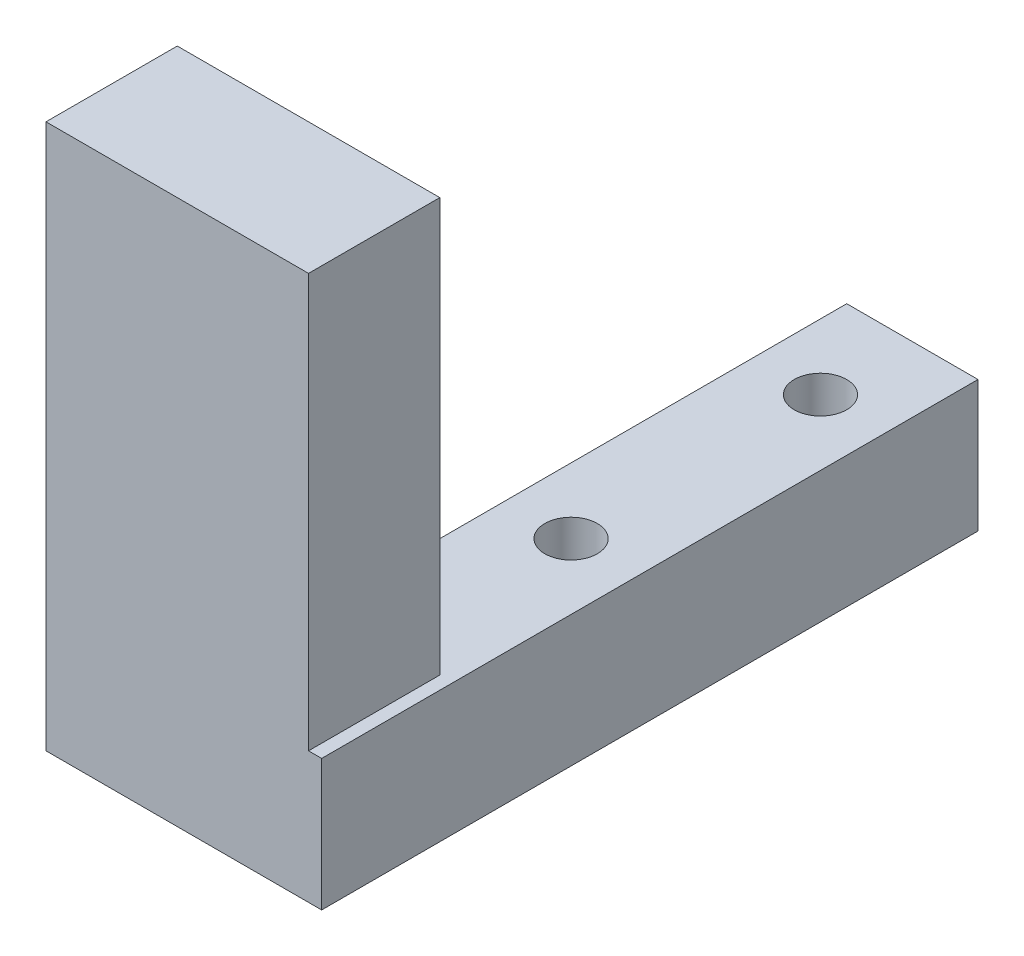
ISO-10303-21;
HEADER;
FILE_DESCRIPTION(('STEP AP214'),'2;1');
FILE_NAME('part.step','',(''),(''),'','','');
FILE_SCHEMA(('AUTOMOTIVE_DESIGN { 1 0 10303 214 1 1 1 1 }'));
ENDSEC;
DATA;
#1=APPLICATION_CONTEXT('core data for automotive mechanical design processes');
#2=APPLICATION_PROTOCOL_DEFINITION('international standard','automotive_design',2000,#1);
#3=PRODUCT_CONTEXT('',#1,'mechanical');
#4=PRODUCT('Part','Part','',(#3));
#5=PRODUCT_RELATED_PRODUCT_CATEGORY('part','',(#4));
#6=PRODUCT_DEFINITION_FORMATION('','',#4);
#7=PRODUCT_DEFINITION_CONTEXT('part definition',#1,'design');
#8=PRODUCT_DEFINITION('design','',#6,#7);
#9=PRODUCT_DEFINITION_SHAPE('','',#8);
#10=(LENGTH_UNIT() NAMED_UNIT(*) SI_UNIT(.MILLI.,.METRE.));
#11=(NAMED_UNIT(*) PLANE_ANGLE_UNIT() SI_UNIT($,.RADIAN.));
#12=(NAMED_UNIT(*) SI_UNIT($,.STERADIAN.) SOLID_ANGLE_UNIT());
#13=UNCERTAINTY_MEASURE_WITH_UNIT(LENGTH_MEASURE(1.E-05),#10,'distance_accuracy_value','');
#14=(GEOMETRIC_REPRESENTATION_CONTEXT(3) GLOBAL_UNCERTAINTY_ASSIGNED_CONTEXT((#13)) GLOBAL_UNIT_ASSIGNED_CONTEXT((#10,
#11,#12)) REPRESENTATION_CONTEXT('',''));
#15=CARTESIAN_POINT('',(0.,0.,0.));
#16=DIRECTION('',(0.,0.,1.));
#17=DIRECTION('',(1.,0.,0.));
#18=AXIS2_PLACEMENT_3D('',#15,#16,#17);
#19=CARTESIAN_POINT('',(-7.85128298838194,3.64329268292683,50.));
#20=DIRECTION('',(0.,-1.,0.));
#21=DIRECTION('',(0.,0.,-1.));
#22=AXIS2_PLACEMENT_3D('',#19,#20,#21);
#23=PLANE('',#22);
#24=CARTESIAN_POINT('',(-2.85128298838193,3.64329268292683,26.));
#25=DIRECTION('',(0.,1.,0.));
#26=DIRECTION('',(0.,0.,1.));
#27=AXIS2_PLACEMENT_3D('',#24,#25,#26);
#28=CIRCLE('',#27,2.);
#29=CARTESIAN_POINT('',(-2.85128298838193,3.64329268292683,28.));
#30=VERTEX_POINT('',#29);
#31=EDGE_CURVE('E131',#30,#30,#28,.T.);
#32=ORIENTED_EDGE('',*,*,#31,.F.);
#33=EDGE_LOOP('',(#32));
#34=FACE_BOUND('',#33,.T.);
#35=CARTESIAN_POINT('',(-2.85128298838194,3.64329268292683,7.));
#36=DIRECTION('',(0.,1.,0.));
#37=DIRECTION('',(0.,0.,1.));
#38=AXIS2_PLACEMENT_3D('',#35,#36,#37);
#39=CIRCLE('',#38,2.);
#40=CARTESIAN_POINT('',(-2.85128298838194,3.64329268292683,9.));
#41=VERTEX_POINT('',#40);
#42=EDGE_CURVE('E134',#41,#41,#39,.T.);
#43=ORIENTED_EDGE('',*,*,#42,.F.);
#44=EDGE_LOOP('',(#43));
#45=FACE_BOUND('',#44,.T.);
#46=DIRECTION('',(-1.,0.,0.));
#47=VECTOR('',#46,1.);
#48=CARTESIAN_POINT('',(-18.8512829883819,3.64329268292683,40.));
#49=LINE('',#48,#47);
#50=CARTESIAN_POINT('',(1.14871701161806,3.64329268292683,40.));
#51=VERTEX_POINT('',#50);
#52=CARTESIAN_POINT('',(-7.85128298838194,3.64329268292683,40.));
#53=VERTEX_POINT('',#52);
#54=EDGE_CURVE('E142',#51,#53,#49,.T.);
#55=ORIENTED_EDGE('',*,*,#54,.F.);
#56=DIRECTION('',(0.,0.,-1.));
#57=VECTOR('',#56,1.);
#58=CARTESIAN_POINT('',(1.14871701161806,3.64329268292683,50.));
#59=LINE('',#58,#57);
#60=CARTESIAN_POINT('',(1.14871701161806,3.64329268292683,50.));
#61=VERTEX_POINT('',#60);
#62=EDGE_CURVE('E52',#61,#51,#59,.T.);
#63=ORIENTED_EDGE('',*,*,#62,.F.);
#64=DIRECTION('',(-1.,0.,0.));
#65=VECTOR('',#64,1.);
#66=CARTESIAN_POINT('',(-7.85128298838194,3.64329268292683,50.));
#67=LINE('',#66,#65);
#68=CARTESIAN_POINT('',(2.14871701161806,3.64329268292683,50.));
#69=VERTEX_POINT('',#68);
#70=EDGE_CURVE('E162',#69,#61,#67,.T.);
#71=ORIENTED_EDGE('',*,*,#70,.F.);
#72=DIRECTION('',(0.,0.,-1.));
#73=VECTOR('',#72,1.);
#74=CARTESIAN_POINT('',(2.14871701161806,3.64329268292683,50.));
#75=LINE('',#74,#73);
#76=CARTESIAN_POINT('',(2.14871701161806,3.64329268292683,0.));
#77=VERTEX_POINT('',#76);
#78=EDGE_CURVE('E179',#69,#77,#75,.T.);
#79=ORIENTED_EDGE('',*,*,#78,.T.);
#80=DIRECTION('',(-1.,0.,0.));
#81=VECTOR('',#80,1.);
#82=CARTESIAN_POINT('',(-7.85128298838194,3.64329268292683,0.));
#83=LINE('',#82,#81);
#84=CARTESIAN_POINT('',(-7.85128298838194,3.64329268292683,0.));
#85=VERTEX_POINT('',#84);
#86=EDGE_CURVE('E175',#77,#85,#83,.T.);
#87=ORIENTED_EDGE('',*,*,#86,.T.);
#88=DIRECTION('',(0.,0.,-1.));
#89=VECTOR('',#88,1.);
#90=CARTESIAN_POINT('',(-7.85128298838194,3.64329268292683,50.));
#91=LINE('',#90,#89);
#92=EDGE_CURVE('E155',#53,#85,#91,.T.);
#93=ORIENTED_EDGE('',*,*,#92,.F.);
#94=EDGE_LOOP('',(#55,#63,#71,#79,#87,#93));
#95=FACE_BOUND('',#94,.T.);
#96=ADVANCED_FACE('F35',(#34,#45,#95),#23,.F.);
#97=CARTESIAN_POINT('',(-7.85128298838194,3.64329268292683,50.));
#98=DIRECTION('',(1.,0.,0.));
#99=DIRECTION('',(0.,1.,0.));
#100=AXIS2_PLACEMENT_3D('',#97,#98,#99);
#101=PLANE('',#100);
#102=DIRECTION('',(0.,-1.,0.));
#103=VECTOR('',#102,1.);
#104=CARTESIAN_POINT('',(-7.85128298838194,3.64329268292683,40.));
#105=LINE('',#104,#103);
#106=CARTESIAN_POINT('',(-7.85128298838193,-6.35670731707317,40.));
#107=VERTEX_POINT('',#106);
#108=EDGE_CURVE('E60',#53,#107,#105,.T.);
#109=ORIENTED_EDGE('',*,*,#108,.F.);
#110=ORIENTED_EDGE('',*,*,#92,.T.);
#111=DIRECTION('',(0.,-1.,0.));
#112=VECTOR('',#111,1.);
#113=CARTESIAN_POINT('',(-7.85128298838194,3.64329268292683,0.));
#114=LINE('',#113,#112);
#115=CARTESIAN_POINT('',(-7.85128298838193,-6.35670731707317,0.));
#116=VERTEX_POINT('',#115);
#117=EDGE_CURVE('E159',#85,#116,#114,.T.);
#118=ORIENTED_EDGE('',*,*,#117,.T.);
#119=DIRECTION('',(0.,0.,-1.));
#120=VECTOR('',#119,1.);
#121=CARTESIAN_POINT('',(-7.85128298838193,-6.35670731707317,50.));
#122=LINE('',#121,#120);
#123=EDGE_CURVE('E11',#107,#116,#122,.T.);
#124=ORIENTED_EDGE('',*,*,#123,.F.);
#125=EDGE_LOOP('',(#109,#110,#118,#124));
#126=FACE_BOUND('',#125,.T.);
#127=ADVANCED_FACE('F37',(#126),#101,.F.);
#128=CARTESIAN_POINT('',(-7.85128298838193,-6.35670731707317,50.));
#129=DIRECTION('',(0.,1.,0.));
#130=DIRECTION('',(0.,0.,1.));
#131=AXIS2_PLACEMENT_3D('',#128,#129,#130);
#132=PLANE('',#131);
#133=CARTESIAN_POINT('',(-2.85128298838193,-6.35670731707317,26.));
#134=DIRECTION('',(0.,1.,0.));
#135=DIRECTION('',(0.,0.,1.));
#136=AXIS2_PLACEMENT_3D('',#133,#134,#135);
#137=CIRCLE('',#136,2.);
#138=CARTESIAN_POINT('',(-2.85128298838193,-6.35670731707317,28.));
#139=VERTEX_POINT('',#138);
#140=EDGE_CURVE('E39',#139,#139,#137,.T.);
#141=ORIENTED_EDGE('',*,*,#140,.T.);
#142=EDGE_LOOP('',(#141));
#143=FACE_BOUND('',#142,.T.);
#144=CARTESIAN_POINT('',(-2.85128298838194,-6.35670731707317,7.));
#145=DIRECTION('',(0.,1.,0.));
#146=DIRECTION('',(0.,0.,1.));
#147=AXIS2_PLACEMENT_3D('',#144,#145,#146);
#148=CIRCLE('',#147,2.);
#149=CARTESIAN_POINT('',(-2.85128298838194,-6.35670731707317,9.));
#150=VERTEX_POINT('',#149);
#151=EDGE_CURVE('E137',#150,#150,#148,.T.);
#152=ORIENTED_EDGE('',*,*,#151,.T.);
#153=EDGE_LOOP('',(#152));
#154=FACE_BOUND('',#153,.T.);
#155=DIRECTION('',(1.,0.,0.));
#156=VECTOR('',#155,1.);
#157=CARTESIAN_POINT('',(-7.85128298838193,-6.35670731707317,0.));
#158=LINE('',#157,#156);
#159=CARTESIAN_POINT('',(2.14871701161806,-6.35670731707317,0.));
#160=VERTEX_POINT('',#159);
#161=EDGE_CURVE('E171',#116,#160,#158,.T.);
#162=ORIENTED_EDGE('',*,*,#161,.T.);
#163=DIRECTION('',(0.,0.,-1.));
#164=VECTOR('',#163,1.);
#165=CARTESIAN_POINT('',(2.14871701161806,-6.35670731707317,50.));
#166=LINE('',#165,#164);
#167=CARTESIAN_POINT('',(2.14871701161806,-6.35670731707317,50.));
#168=VERTEX_POINT('',#167);
#169=EDGE_CURVE('E44',#168,#160,#166,.T.);
#170=ORIENTED_EDGE('',*,*,#169,.F.);
#171=DIRECTION('',(1.,0.,0.));
#172=VECTOR('',#171,1.);
#173=CARTESIAN_POINT('',(-7.85128298838193,-6.35670731707317,50.));
#174=LINE('',#173,#172);
#175=CARTESIAN_POINT('',(-18.8512829883819,-6.35670731707317,50.));
#176=VERTEX_POINT('',#175);
#177=EDGE_CURVE('E150',#176,#168,#174,.T.);
#178=ORIENTED_EDGE('',*,*,#177,.F.);
#179=DIRECTION('',(0.,0.,1.));
#180=VECTOR('',#179,1.);
#181=CARTESIAN_POINT('',(-18.8512829883819,-6.35670731707317,50.));
#182=LINE('',#181,#180);
#183=CARTESIAN_POINT('',(-18.8512829883819,-6.35670731707317,40.));
#184=VERTEX_POINT('',#183);
#185=EDGE_CURVE('E109',#184,#176,#182,.T.);
#186=ORIENTED_EDGE('',*,*,#185,.F.);
#187=DIRECTION('',(1.,0.,0.));
#188=VECTOR('',#187,1.);
#189=CARTESIAN_POINT('',(-18.8512829883819,-6.35670731707317,40.));
#190=LINE('',#189,#188);
#191=EDGE_CURVE('E147',#184,#107,#190,.T.);
#192=ORIENTED_EDGE('',*,*,#191,.T.);
#193=ORIENTED_EDGE('',*,*,#123,.T.);
#194=EDGE_LOOP('',(#162,#170,#178,#186,#192,#193));
#195=FACE_BOUND('',#194,.T.);
#196=ADVANCED_FACE('F207',(#143,#154,#195),#132,.F.);
#197=CARTESIAN_POINT('',(2.14871701161806,3.64329268292683,50.));
#198=DIRECTION('',(-1.,0.,0.));
#199=DIRECTION('',(0.,-1.,0.));
#200=AXIS2_PLACEMENT_3D('',#197,#198,#199);
#201=PLANE('',#200);
#202=DIRECTION('',(0.,1.,0.));
#203=VECTOR('',#202,1.);
#204=CARTESIAN_POINT('',(2.14871701161806,3.64329268292683,0.));
#205=LINE('',#204,#203);
#206=EDGE_CURVE('E173',#160,#77,#205,.T.);
#207=ORIENTED_EDGE('',*,*,#206,.T.);
#208=ORIENTED_EDGE('',*,*,#78,.F.);
#209=DIRECTION('',(0.,1.,0.));
#210=VECTOR('',#209,1.);
#211=CARTESIAN_POINT('',(2.14871701161806,3.64329268292683,50.));
#212=LINE('',#211,#210);
#213=EDGE_CURVE('E165',#168,#69,#212,.T.);
#214=ORIENTED_EDGE('',*,*,#213,.F.);
#215=ORIENTED_EDGE('',*,*,#169,.T.);
#216=EDGE_LOOP('',(#207,#208,#214,#215));
#217=FACE_BOUND('',#216,.T.);
#218=ADVANCED_FACE('F189',(#217),#201,.F.);
#219=CARTESIAN_POINT('',(0.,0.,50.));
#220=DIRECTION('',(0.,0.,1.));
#221=DIRECTION('',(1.,0.,0.));
#222=AXIS2_PLACEMENT_3D('',#219,#220,#221);
#223=PLANE('',#222);
#224=ORIENTED_EDGE('',*,*,#70,.T.);
#225=DIRECTION('',(0.,-1.,0.));
#226=VECTOR('',#225,1.);
#227=CARTESIAN_POINT('',(1.14871701161806,26.6432926829268,50.));
#228=LINE('',#227,#226);
#229=CARTESIAN_POINT('',(1.14871701161806,35.1432926829268,50.));
#230=VERTEX_POINT('',#229);
#231=EDGE_CURVE('E117',#230,#61,#228,.T.);
#232=ORIENTED_EDGE('',*,*,#231,.F.);
#233=DIRECTION('',(1.,0.,0.));
#234=VECTOR('',#233,1.);
#235=CARTESIAN_POINT('',(-18.8512829883819,35.1432926829268,50.));
#236=LINE('',#235,#234);
#237=CARTESIAN_POINT('',(-18.8512829883819,35.1432926829268,50.));
#238=VERTEX_POINT('',#237);
#239=EDGE_CURVE('E114',#238,#230,#236,.T.);
#240=ORIENTED_EDGE('',*,*,#239,.F.);
#241=DIRECTION('',(0.,1.,0.));
#242=VECTOR('',#241,1.);
#243=CARTESIAN_POINT('',(-18.8512829883819,3.64329268292683,50.));
#244=LINE('',#243,#242);
#245=EDGE_CURVE('E103',#176,#238,#244,.T.);
#246=ORIENTED_EDGE('',*,*,#245,.F.);
#247=ORIENTED_EDGE('',*,*,#177,.T.);
#248=ORIENTED_EDGE('',*,*,#213,.T.);
#249=EDGE_LOOP('',(#224,#232,#240,#246,#247,#248));
#250=FACE_BOUND('',#249,.T.);
#251=ADVANCED_FACE('F115',(#250),#223,.T.);
#252=CARTESIAN_POINT('',(0.,0.,0.));
#253=DIRECTION('',(0.,0.,1.));
#254=DIRECTION('',(1.,0.,0.));
#255=AXIS2_PLACEMENT_3D('',#252,#253,#254);
#256=PLANE('',#255);
#257=ORIENTED_EDGE('',*,*,#117,.F.);
#258=ORIENTED_EDGE('',*,*,#86,.F.);
#259=ORIENTED_EDGE('',*,*,#206,.F.);
#260=ORIENTED_EDGE('',*,*,#161,.F.);
#261=EDGE_LOOP('',(#257,#258,#259,#260));
#262=FACE_BOUND('',#261,.T.);
#263=ADVANCED_FACE('F196',(#262),#256,.F.);
#264=CARTESIAN_POINT('',(-18.8512829883819,3.64329268292682,40.));
#265=DIRECTION('',(0.,0.,1.));
#266=DIRECTION('',(1.,0.,0.));
#267=AXIS2_PLACEMENT_3D('',#264,#265,#266);
#268=PLANE('',#267);
#269=ORIENTED_EDGE('',*,*,#191,.F.);
#270=DIRECTION('',(0.,-1.,0.));
#271=VECTOR('',#270,1.);
#272=CARTESIAN_POINT('',(-18.8512829883819,3.64329268292682,40.));
#273=LINE('',#272,#271);
#274=CARTESIAN_POINT('',(-18.8512829883819,35.1432926829268,40.));
#275=VERTEX_POINT('',#274);
#276=EDGE_CURVE('E111',#275,#184,#273,.T.);
#277=ORIENTED_EDGE('',*,*,#276,.F.);
#278=DIRECTION('',(-1.,0.,0.));
#279=VECTOR('',#278,1.);
#280=CARTESIAN_POINT('',(-18.8512829883819,35.1432926829268,40.));
#281=LINE('',#280,#279);
#282=CARTESIAN_POINT('',(1.14871701161806,35.1432926829268,40.));
#283=VERTEX_POINT('',#282);
#284=EDGE_CURVE('E126',#283,#275,#281,.T.);
#285=ORIENTED_EDGE('',*,*,#284,.F.);
#286=DIRECTION('',(0.,-1.,0.));
#287=VECTOR('',#286,1.);
#288=CARTESIAN_POINT('',(1.14871701161806,26.6432926829268,40.));
#289=LINE('',#288,#287);
#290=EDGE_CURVE('E140',#283,#51,#289,.T.);
#291=ORIENTED_EDGE('',*,*,#290,.T.);
#292=ORIENTED_EDGE('',*,*,#54,.T.);
#293=ORIENTED_EDGE('',*,*,#108,.T.);
#294=EDGE_LOOP('',(#269,#277,#285,#291,#292,#293));
#295=FACE_BOUND('',#294,.T.);
#296=ADVANCED_FACE('F252',(#295),#268,.F.);
#297=CARTESIAN_POINT('',(-18.8512829883819,0.,0.));
#298=DIRECTION('',(1.,0.,0.));
#299=DIRECTION('',(0.,1.,0.));
#300=AXIS2_PLACEMENT_3D('',#297,#298,#299);
#301=PLANE('',#300);
#302=ORIENTED_EDGE('',*,*,#245,.T.);
#303=DIRECTION('',(0.,0.,1.));
#304=VECTOR('',#303,1.);
#305=CARTESIAN_POINT('',(-18.8512829883819,35.1432926829268,50.));
#306=LINE('',#305,#304);
#307=EDGE_CURVE('E107',#275,#238,#306,.T.);
#308=ORIENTED_EDGE('',*,*,#307,.F.);
#309=ORIENTED_EDGE('',*,*,#276,.T.);
#310=ORIENTED_EDGE('',*,*,#185,.T.);
#311=EDGE_LOOP('',(#302,#308,#309,#310));
#312=FACE_BOUND('',#311,.T.);
#313=ADVANCED_FACE('F105',(#312),#301,.F.);
#314=CARTESIAN_POINT('',(1.14871701161806,26.6432926829268,50.));
#315=DIRECTION('',(-1.,0.,0.));
#316=DIRECTION('',(0.,0.,1.));
#317=AXIS2_PLACEMENT_3D('',#314,#315,#316);
#318=PLANE('',#317);
#319=ORIENTED_EDGE('',*,*,#62,.T.);
#320=ORIENTED_EDGE('',*,*,#290,.F.);
#321=DIRECTION('',(0.,0.,-1.));
#322=VECTOR('',#321,1.);
#323=CARTESIAN_POINT('',(1.14871701161806,35.1432926829268,50.));
#324=LINE('',#323,#322);
#325=EDGE_CURVE('E121',#230,#283,#324,.T.);
#326=ORIENTED_EDGE('',*,*,#325,.F.);
#327=ORIENTED_EDGE('',*,*,#231,.T.);
#328=EDGE_LOOP('',(#319,#320,#326,#327));
#329=FACE_BOUND('',#328,.T.);
#330=ADVANCED_FACE('F198',(#329),#318,.F.);
#331=CARTESIAN_POINT('',(-2.85128298838194,-19.3567073170732,7.));
#332=DIRECTION('',(0.,1.,0.));
#333=DIRECTION('',(0.,0.,1.));
#334=AXIS2_PLACEMENT_3D('',#331,#332,#333);
#335=CYLINDRICAL_SURFACE('',#334,2.);
#336=ORIENTED_EDGE('',*,*,#42,.T.);
#337=EDGE_LOOP('',(#336));
#338=FACE_BOUND('',#337,.T.);
#339=ORIENTED_EDGE('',*,*,#151,.F.);
#340=EDGE_LOOP('',(#339));
#341=FACE_BOUND('',#340,.T.);
#342=ADVANCED_FACE('F209',(#338,#341),#335,.F.);
#343=CARTESIAN_POINT('',(-2.85128298838193,-19.3567073170732,26.));
#344=DIRECTION('',(0.,1.,0.));
#345=DIRECTION('',(0.,0.,1.));
#346=AXIS2_PLACEMENT_3D('',#343,#344,#345);
#347=CYLINDRICAL_SURFACE('',#346,2.);
#348=ORIENTED_EDGE('',*,*,#31,.T.);
#349=EDGE_LOOP('',(#348));
#350=FACE_BOUND('',#349,.T.);
#351=ORIENTED_EDGE('',*,*,#140,.F.);
#352=EDGE_LOOP('',(#351));
#353=FACE_BOUND('',#352,.T.);
#354=ADVANCED_FACE('F211',(#350,#353),#347,.F.);
#355=CARTESIAN_POINT('',(0.,35.1432926829268,0.));
#356=DIRECTION('',(0.,-1.,0.));
#357=DIRECTION('',(0.,0.,-1.));
#358=AXIS2_PLACEMENT_3D('',#355,#356,#357);
#359=PLANE('',#358);
#360=ORIENTED_EDGE('',*,*,#307,.T.);
#361=ORIENTED_EDGE('',*,*,#239,.T.);
#362=ORIENTED_EDGE('',*,*,#325,.T.);
#363=ORIENTED_EDGE('',*,*,#284,.T.);
#364=EDGE_LOOP('',(#360,#361,#362,#363));
#365=FACE_BOUND('',#364,.T.);
#366=ADVANCED_FACE('F124',(#365),#359,.F.);
#367=CLOSED_SHELL('',(#96,#127,#196,#218,#251,#263,#296,#313,#330,#342,#354,#366));
#368=MANIFOLD_SOLID_BREP('B2',#367);
#369=ADVANCED_BREP_SHAPE_REPRESENTATION('',(#18,#368),#14);
#370=SHAPE_DEFINITION_REPRESENTATION(#9,#369);
ENDSEC;
END-ISO-10303-21;
